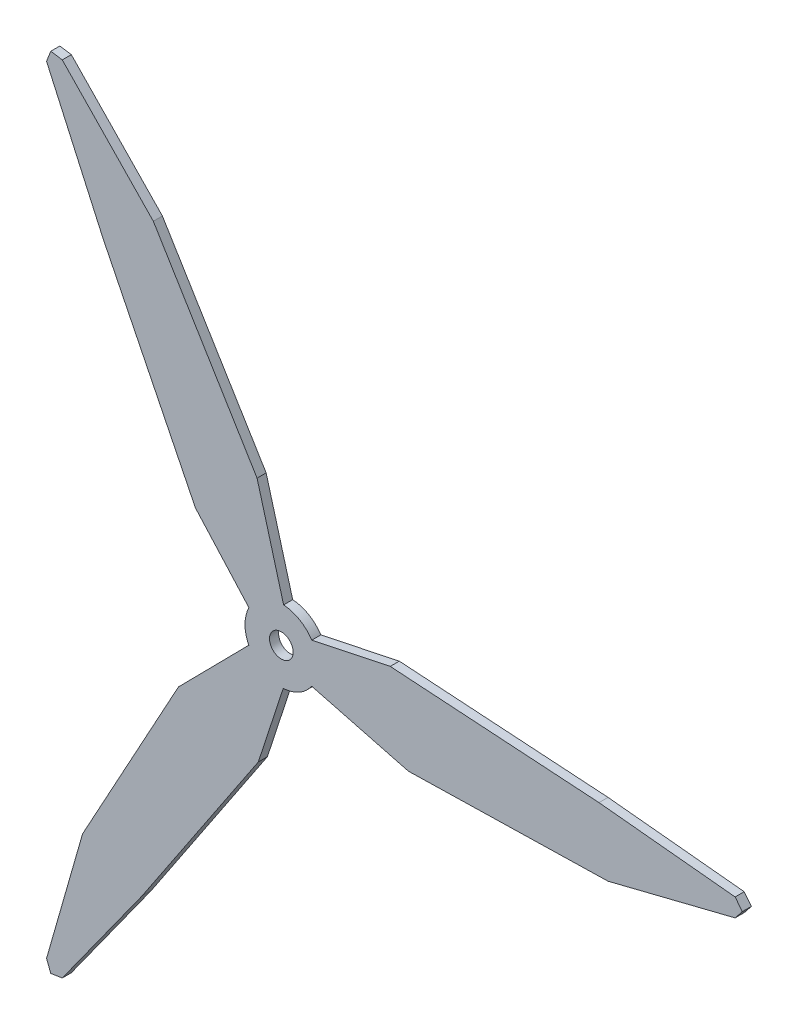
ISO-10303-21;
HEADER;
FILE_DESCRIPTION(('STEP AP214'),'2;1');
FILE_NAME('part.step','',(''),(''),'','','');
FILE_SCHEMA(('AUTOMOTIVE_DESIGN { 1 0 10303 214 1 1 1 1 }'));
ENDSEC;
DATA;
#1=APPLICATION_CONTEXT('core data for automotive mechanical design processes');
#2=APPLICATION_PROTOCOL_DEFINITION('international standard','automotive_design',2000,#1);
#3=PRODUCT_CONTEXT('',#1,'mechanical');
#4=PRODUCT('Part','Part','',(#3));
#5=PRODUCT_RELATED_PRODUCT_CATEGORY('part','',(#4));
#6=PRODUCT_DEFINITION_FORMATION('','',#4);
#7=PRODUCT_DEFINITION_CONTEXT('part definition',#1,'design');
#8=PRODUCT_DEFINITION('design','',#6,#7);
#9=PRODUCT_DEFINITION_SHAPE('','',#8);
#10=(LENGTH_UNIT() NAMED_UNIT(*) SI_UNIT(.MILLI.,.METRE.));
#11=(NAMED_UNIT(*) PLANE_ANGLE_UNIT() SI_UNIT($,.RADIAN.));
#12=(NAMED_UNIT(*) SI_UNIT($,.STERADIAN.) SOLID_ANGLE_UNIT());
#13=UNCERTAINTY_MEASURE_WITH_UNIT(LENGTH_MEASURE(1.E-05),#10,'distance_accuracy_value','');
#14=(GEOMETRIC_REPRESENTATION_CONTEXT(3) GLOBAL_UNCERTAINTY_ASSIGNED_CONTEXT((#13)) GLOBAL_UNIT_ASSIGNED_CONTEXT((#10,
#11,#12)) REPRESENTATION_CONTEXT('',''));
#15=CARTESIAN_POINT('',(0.,0.,0.));
#16=DIRECTION('',(0.,0.,1.));
#17=DIRECTION('',(1.,0.,0.));
#18=AXIS2_PLACEMENT_3D('',#15,#16,#17);
#19=CARTESIAN_POINT('',(0.,0.,2.));
#20=DIRECTION('',(0.,0.,-1.));
#21=DIRECTION('',(-1.,0.,0.));
#22=AXIS2_PLACEMENT_3D('',#19,#20,#21);
#23=CYLINDRICAL_SURFACE('',#22,8.);
#24=DIRECTION('',(0.,0.,-1.));
#25=VECTOR('',#24,1.);
#26=CARTESIAN_POINT('',(-7.16878117640932,-3.55085573415189,2.));
#27=LINE('',#26,#25);
#28=CARTESIAN_POINT('',(-7.16878117640932,-3.55085573415189,2.));
#29=VERTEX_POINT('',#28);
#30=CARTESIAN_POINT('',(-7.16878117640932,-3.55085573415189,0.));
#31=VERTEX_POINT('',#30);
#32=EDGE_CURVE('E62',#29,#31,#27,.T.);
#33=ORIENTED_EDGE('',*,*,#32,.F.);
#34=CARTESIAN_POINT('',(0.,0.,2.));
#35=DIRECTION('',(0.,0.,1.));
#36=DIRECTION('',(1.,0.,0.));
#37=AXIS2_PLACEMENT_3D('',#34,#35,#36);
#38=CIRCLE('',#37,8.);
#39=CARTESIAN_POINT('',(-7.12936328686204,3.62934968333773,2.));
#40=VERTEX_POINT('',#39);
#41=EDGE_CURVE('E401',#40,#29,#38,.T.);
#42=ORIENTED_EDGE('',*,*,#41,.F.);
#43=DIRECTION('',(0.,0.,-1.));
#44=VECTOR('',#43,1.);
#45=CARTESIAN_POINT('',(-7.12936328686204,3.62934968333773,2.));
#46=LINE('',#45,#44);
#47=CARTESIAN_POINT('',(-7.12936328686204,3.62934968333773,0.));
#48=VERTEX_POINT('',#47);
#49=EDGE_CURVE('E316',#48,#40,#46,.F.);
#50=ORIENTED_EDGE('',*,*,#49,.F.);
#51=CARTESIAN_POINT('',(0.,0.,0.));
#52=DIRECTION('',(0.,0.,1.));
#53=DIRECTION('',(1.,0.,0.));
#54=AXIS2_PLACEMENT_3D('',#51,#52,#53);
#55=CIRCLE('',#54,8.);
#56=EDGE_CURVE('E403',#48,#31,#55,.T.);
#57=ORIENTED_EDGE('',*,*,#56,.T.);
#58=EDGE_LOOP('',(#33,#42,#50,#57));
#59=FACE_BOUND('',#58,.T.);
#60=ADVANCED_FACE('F39',(#59),#23,.T.);
#61=DIRECTION('',(0.,0.,-1.));
#62=VECTOR('',#61,1.);
#63=CARTESIAN_POINT('',(0.421572618443538,-7.98888456089952,2.));
#64=LINE('',#63,#62);
#65=CARTESIAN_POINT('',(0.421572618443538,-7.98888456089952,0.));
#66=VERTEX_POINT('',#65);
#67=CARTESIAN_POINT('',(0.421572618443539,-7.98888456089952,2.));
#68=VERTEX_POINT('',#67);
#69=EDGE_CURVE('E261',#66,#68,#64,.F.);
#70=ORIENTED_EDGE('',*,*,#69,.F.);
#71=CARTESIAN_POINT('',(6.65952185915384,-4.43291874586622,0.));
#72=VERTEX_POINT('',#71);
#73=EDGE_CURVE('E243',#66,#72,#55,.T.);
#74=ORIENTED_EDGE('',*,*,#73,.T.);
#75=DIRECTION('',(0.,0.,-1.));
#76=VECTOR('',#75,1.);
#77=CARTESIAN_POINT('',(6.65952185915384,-4.43291874586622,2.));
#78=LINE('',#77,#76);
#79=CARTESIAN_POINT('',(6.65952185915384,-4.43291874586622,2.));
#80=VERTEX_POINT('',#79);
#81=EDGE_CURVE('E11',#80,#72,#78,.T.);
#82=ORIENTED_EDGE('',*,*,#81,.F.);
#83=EDGE_CURVE('E54',#68,#80,#38,.T.);
#84=ORIENTED_EDGE('',*,*,#83,.F.);
#85=EDGE_LOOP('',(#70,#74,#82,#84));
#86=FACE_BOUND('',#85,.T.);
#87=ADVANCED_FACE('F465',(#86),#23,.T.);
#88=DIRECTION('',(0.,0.,-1.));
#89=VECTOR('',#88,1.);
#90=CARTESIAN_POINT('',(0.509259317255481,7.98377448001811,2.));
#91=LINE('',#90,#89);
#92=CARTESIAN_POINT('',(0.509259317255481,7.98377448001811,2.));
#93=VERTEX_POINT('',#92);
#94=CARTESIAN_POINT('',(0.509259317255481,7.98377448001811,0.));
#95=VERTEX_POINT('',#94);
#96=EDGE_CURVE('E334',#93,#95,#91,.T.);
#97=ORIENTED_EDGE('',*,*,#96,.F.);
#98=CARTESIAN_POINT('',(6.7077906684185,4.35953487756179,2.));
#99=VERTEX_POINT('',#98);
#100=EDGE_CURVE('E398',#99,#93,#38,.T.);
#101=ORIENTED_EDGE('',*,*,#100,.F.);
#102=DIRECTION('',(0.,0.,-1.));
#103=VECTOR('',#102,1.);
#104=CARTESIAN_POINT('',(6.7077906684185,4.35953487756179,2.));
#105=LINE('',#104,#103);
#106=CARTESIAN_POINT('',(6.7077906684185,4.35953487756179,0.));
#107=VERTEX_POINT('',#106);
#108=EDGE_CURVE('E47',#107,#99,#105,.F.);
#109=ORIENTED_EDGE('',*,*,#108,.F.);
#110=EDGE_CURVE('E402',#107,#95,#55,.T.);
#111=ORIENTED_EDGE('',*,*,#110,.T.);
#112=EDGE_LOOP('',(#97,#101,#109,#111));
#113=FACE_BOUND('',#112,.T.);
#114=ADVANCED_FACE('F41',(#113),#23,.T.);
#115=CARTESIAN_POINT('',(0.,0.,2.));
#116=DIRECTION('',(0.,0.,1.));
#117=DIRECTION('',(1.,0.,0.));
#118=AXIS2_PLACEMENT_3D('',#115,#116,#117);
#119=PLANE('',#118);
#120=ORIENTED_EDGE('',*,*,#41,.T.);
#121=DIRECTION('',(-0.702412411599189,-0.711770190462772,0.));
#122=VECTOR('',#121,1.);
#123=CARTESIAN_POINT('',(-5.96410161513776,-2.33012701892219,2.));
#124=LINE('',#123,#122);
#125=CARTESIAN_POINT('',(-22.6602540378444,-19.2487113059643,2.));
#126=VERTEX_POINT('',#125);
#127=EDGE_CURVE('E244',#29,#126,#124,.T.);
#128=ORIENTED_EDGE('',*,*,#127,.T.);
#129=DIRECTION('',(-0.480193603526835,-0.877162529484652,0.));
#130=VECTOR('',#129,1.);
#131=CARTESIAN_POINT('',(-22.6602540378444,-19.2487113059643,2.));
#132=LINE('',#131,#130);
#133=CARTESIAN_POINT('',(-43.79422863406,-57.8538290724796,2.));
#134=VERTEX_POINT('',#133);
#135=EDGE_CURVE('E246',#126,#134,#132,.T.);
#136=ORIENTED_EDGE('',*,*,#135,.T.);
#137=DIRECTION('',(-0.275029237468465,-0.961435862934972,0.));
#138=VECTOR('',#137,1.);
#139=CARTESIAN_POINT('',(-43.79422863406,-57.8538290724796,2.));
#140=LINE('',#139,#138);
#141=CARTESIAN_POINT('',(-51.7320508075689,-85.6025403784438,2.));
#142=VERTEX_POINT('',#141);
#143=EDGE_CURVE('E271',#134,#142,#140,.T.);
#144=ORIENTED_EDGE('',*,*,#143,.T.);
#145=DIRECTION('',(0.363904702223363,-0.931436185521974,0.));
#146=VECTOR('',#145,1.);
#147=CARTESIAN_POINT('',(-51.7320508075689,-85.6025403784438,2.));
#148=LINE('',#147,#146);
#149=CARTESIAN_POINT('',(-50.8,-87.9881810244989,2.));
#150=VERTEX_POINT('',#149);
#151=EDGE_CURVE('E269',#142,#150,#148,.T.);
#152=ORIENTED_EDGE('',*,*,#151,.T.);
#153=DIRECTION('',(0.988599749777787,0.15056737607894,0.));
#154=VECTOR('',#153,1.);
#155=CARTESIAN_POINT('',(-50.8,-87.9881810244989,2.));
#156=LINE('',#155,#154);
#157=CARTESIAN_POINT('',(-48.2679491924312,-87.6025403784438,2.));
#158=VERTEX_POINT('',#157);
#159=EDGE_CURVE('E267',#150,#158,#156,.T.);
#160=ORIENTED_EDGE('',*,*,#159,.T.);
#161=DIRECTION('',(0.583691343548209,0.81197562492164,0.));
#162=VECTOR('',#161,1.);
#163=CARTESIAN_POINT('',(-48.2679491924312,-87.6025403784438,2.));
#164=LINE('',#163,#162);
#165=CARTESIAN_POINT('',(-30.6698729810778,-63.1217782649107,2.));
#166=VERTEX_POINT('',#165);
#167=EDGE_CURVE('E265',#158,#166,#164,.T.);
#168=ORIENTED_EDGE('',*,*,#167,.T.);
#169=DIRECTION('',(0.555300239180573,0.831649953024708,0.));
#170=VECTOR('',#169,1.);
#171=CARTESIAN_POINT('',(-30.6698729810778,-63.1217782649107,2.));
#172=LINE('',#171,#170);
#173=CARTESIAN_POINT('',(-5.0717967697245,-24.7846096908265,2.));
#174=VERTEX_POINT('',#173);
#175=EDGE_CURVE('E263',#166,#174,#172,.T.);
#176=ORIENTED_EDGE('',*,*,#175,.T.);
#177=DIRECTION('',(0.310864582458359,0.950454213191246,0.));
#178=VECTOR('',#177,1.);
#179=CARTESIAN_POINT('',(-5.0717967697245,-24.7846096908265,2.));
#180=LINE('',#179,#178);
#181=EDGE_CURVE('E238',#174,#68,#180,.T.);
#182=ORIENTED_EDGE('',*,*,#181,.T.);
#183=ORIENTED_EDGE('',*,*,#83,.T.);
#184=DIRECTION('',(0.967617272396844,-0.252421897147003,0.));
#185=VECTOR('',#184,1.);
#186=CARTESIAN_POINT('',(5.,-4.,2.));
#187=LINE('',#186,#185);
#188=CARTESIAN_POINT('',(28.,-10.,2.));
#189=VERTEX_POINT('',#188);
#190=EDGE_CURVE('E338',#80,#189,#187,.T.);
#191=ORIENTED_EDGE('',*,*,#190,.T.);
#192=DIRECTION('',(0.999741835544943,0.0227214053532942,0.));
#193=VECTOR('',#192,1.);
#194=CARTESIAN_POINT('',(28.,-10.,2.));
#195=LINE('',#194,#193);
#196=CARTESIAN_POINT('',(72.,-9.,2.));
#197=VERTEX_POINT('',#196);
#198=EDGE_CURVE('E340',#189,#197,#195,.T.);
#199=ORIENTED_EDGE('',*,*,#198,.T.);
#200=DIRECTION('',(0.970142500145332,0.242535625036333,0.));
#201=VECTOR('',#200,1.);
#202=CARTESIAN_POINT('',(72.,-9.,2.));
#203=LINE('',#202,#201);
#204=CARTESIAN_POINT('',(100.,-2.,2.));
#205=VERTEX_POINT('',#204);
#206=EDGE_CURVE('E343',#197,#205,#203,.T.);
#207=ORIENTED_EDGE('',*,*,#206,.T.);
#208=DIRECTION('',(0.624695047554422,0.780868809443032,0.));
#209=VECTOR('',#208,1.);
#210=CARTESIAN_POINT('',(100.,-2.,2.));
#211=LINE('',#210,#209);
#212=CARTESIAN_POINT('',(101.6,0.,2.));
#213=VERTEX_POINT('',#212);
#214=EDGE_CURVE('E345',#205,#213,#211,.T.);
#215=ORIENTED_EDGE('',*,*,#214,.T.);
#216=DIRECTION('',(-0.624695047554422,0.780868809443032,0.));
#217=VECTOR('',#216,1.);
#218=CARTESIAN_POINT('',(101.6,0.,2.));
#219=LINE('',#218,#217);
#220=CARTESIAN_POINT('',(100.,2.,2.));
#221=VERTEX_POINT('',#220);
#222=EDGE_CURVE('E347',#213,#221,#219,.T.);
#223=ORIENTED_EDGE('',*,*,#222,.T.);
#224=DIRECTION('',(-0.995037190209989,0.0995037190209989,0.));
#225=VECTOR('',#224,1.);
#226=CARTESIAN_POINT('',(100.,2.,2.));
#227=LINE('',#226,#225);
#228=CARTESIAN_POINT('',(70.,5.,2.));
#229=VERTEX_POINT('',#228);
#230=EDGE_CURVE('E349',#221,#229,#227,.T.);
#231=ORIENTED_EDGE('',*,*,#230,.T.);
#232=DIRECTION('',(-0.997880105965818,0.0650791373455968,0.));
#233=VECTOR('',#232,1.);
#234=CARTESIAN_POINT('',(70.,5.,2.));
#235=LINE('',#234,#233);
#236=CARTESIAN_POINT('',(24.,8.,2.));
#237=VERTEX_POINT('',#236);
#238=EDGE_CURVE('E351',#229,#237,#235,.T.);
#239=ORIENTED_EDGE('',*,*,#238,.T.);
#240=DIRECTION('',(-0.978549784986749,-0.206010481049842,0.));
#241=VECTOR('',#240,1.);
#242=CARTESIAN_POINT('',(24.,8.,2.));
#243=LINE('',#242,#241);
#244=EDGE_CURVE('E353',#237,#99,#243,.T.);
#245=ORIENTED_EDGE('',*,*,#244,.T.);
#246=ORIENTED_EDGE('',*,*,#100,.T.);
#247=DIRECTION('',(-0.265204860797655,0.964192087609775,0.));
#248=VECTOR('',#247,1.);
#249=CARTESIAN_POINT('',(0.964101615137756,6.33012701892219,2.));
#250=LINE('',#249,#248);
#251=CARTESIAN_POINT('',(-5.33974596215561,29.2487113059643,2.));
#252=VERTEX_POINT('',#251);
#253=EDGE_CURVE('E302',#93,#252,#250,.T.);
#254=ORIENTED_EDGE('',*,*,#253,.T.);
#255=DIRECTION('',(-0.519548232018108,0.854441124131358,0.));
#256=VECTOR('',#255,1.);
#257=CARTESIAN_POINT('',(-5.33974596215561,29.2487113059643,2.));
#258=LINE('',#257,#256);
#259=CARTESIAN_POINT('',(-28.20577136594,66.8538290724796,2.));
#260=VERTEX_POINT('',#259);
#261=EDGE_CURVE('E329',#252,#260,#258,.T.);
#262=ORIENTED_EDGE('',*,*,#261,.T.);
#263=DIRECTION('',(-0.695113262676867,0.71890023789864,0.));
#264=VECTOR('',#263,1.);
#265=CARTESIAN_POINT('',(-28.20577136594,66.8538290724796,2.));
#266=LINE('',#265,#264);
#267=CARTESIAN_POINT('',(-48.2679491924311,87.6025403784439,2.));
#268=VERTEX_POINT('',#267);
#269=EDGE_CURVE('E327',#260,#268,#266,.T.);
#270=ORIENTED_EDGE('',*,*,#269,.T.);
#271=DIRECTION('',(-0.988599749777787,0.15056737607894,0.));
#272=VECTOR('',#271,1.);
#273=CARTESIAN_POINT('',(-48.2679491924311,87.6025403784439,2.));
#274=LINE('',#273,#272);
#275=CARTESIAN_POINT('',(-50.8,87.988181024499,2.));
#276=VERTEX_POINT('',#275);
#277=EDGE_CURVE('E325',#268,#276,#274,.T.);
#278=ORIENTED_EDGE('',*,*,#277,.T.);
#279=DIRECTION('',(-0.363904702223363,-0.931436185521974,0.));
#280=VECTOR('',#279,1.);
#281=CARTESIAN_POINT('',(-50.8,87.988181024499,2.));
#282=LINE('',#281,#280);
#283=CARTESIAN_POINT('',(-51.7320508075689,85.6025403784439,2.));
#284=VERTEX_POINT('',#283);
#285=EDGE_CURVE('E323',#276,#284,#282,.T.);
#286=ORIENTED_EDGE('',*,*,#285,.T.);
#287=DIRECTION('',(0.41134584666178,-0.911479343942639,0.));
#288=VECTOR('',#287,1.);
#289=CARTESIAN_POINT('',(-51.7320508075689,85.6025403784439,2.));
#290=LINE('',#289,#288);
#291=CARTESIAN_POINT('',(-39.3301270189222,58.1217782649107,2.));
#292=VERTEX_POINT('',#291);
#293=EDGE_CURVE('E321',#284,#292,#290,.T.);
#294=ORIENTED_EDGE('',*,*,#293,.T.);
#295=DIRECTION('',(0.442579866785245,-0.896729090370305,0.));
#296=VECTOR('',#295,1.);
#297=CARTESIAN_POINT('',(-39.3301270189222,58.1217782649107,2.));
#298=LINE('',#297,#296);
#299=CARTESIAN_POINT('',(-18.9282032302755,16.7846096908265,2.));
#300=VERTEX_POINT('',#299);
#301=EDGE_CURVE('E319',#292,#300,#298,.T.);
#302=ORIENTED_EDGE('',*,*,#301,.T.);
#303=DIRECTION('',(0.66768520252839,-0.744443732141404,0.));
#304=VECTOR('',#303,1.);
#305=CARTESIAN_POINT('',(-18.9282032302755,16.7846096908265,2.));
#306=LINE('',#305,#304);
#307=EDGE_CURVE('E297',#300,#40,#306,.T.);
#308=ORIENTED_EDGE('',*,*,#307,.T.);
#309=EDGE_LOOP('',(#120,#128,#136,#144,#152,#160,#168,#176,#182,#183,#191,#199,#207,#215,#223,
#231,#239,#245,#246,#254,#262,#270,#278,#286,#294,#302,#308));
#310=FACE_BOUND('',#309,.T.);
#311=CARTESIAN_POINT('',(0.,0.,2.));
#312=DIRECTION('',(0.,0.,1.));
#313=DIRECTION('',(1.,0.,0.));
#314=AXIS2_PLACEMENT_3D('',#311,#312,#313);
#315=CIRCLE('',#314,2.6);
#316=CARTESIAN_POINT('',(2.6,0.,2.));
#317=VERTEX_POINT('',#316);
#318=EDGE_CURVE('E393',#317,#317,#315,.T.);
#319=ORIENTED_EDGE('',*,*,#318,.F.);
#320=EDGE_LOOP('',(#319));
#321=FACE_BOUND('',#320,.T.);
#322=ADVANCED_FACE('F412',(#310,#321),#119,.T.);
#323=CARTESIAN_POINT('',(0.,0.,0.));
#324=DIRECTION('',(0.,0.,1.));
#325=DIRECTION('',(1.,0.,0.));
#326=AXIS2_PLACEMENT_3D('',#323,#324,#325);
#327=PLANE('',#326);
#328=ORIENTED_EDGE('',*,*,#73,.F.);
#329=DIRECTION('',(0.310864582458359,0.950454213191246,0.));
#330=VECTOR('',#329,1.);
#331=CARTESIAN_POINT('',(-5.0717967697245,-24.7846096908265,0.));
#332=LINE('',#331,#330);
#333=CARTESIAN_POINT('',(-5.0717967697245,-24.7846096908265,0.));
#334=VERTEX_POINT('',#333);
#335=EDGE_CURVE('E232',#334,#66,#332,.T.);
#336=ORIENTED_EDGE('',*,*,#335,.F.);
#337=DIRECTION('',(0.555300239180573,0.831649953024708,0.));
#338=VECTOR('',#337,1.);
#339=CARTESIAN_POINT('',(-30.6698729810778,-63.1217782649107,0.));
#340=LINE('',#339,#338);
#341=CARTESIAN_POINT('',(-30.6698729810778,-63.1217782649107,0.));
#342=VERTEX_POINT('',#341);
#343=EDGE_CURVE('E220',#342,#334,#340,.T.);
#344=ORIENTED_EDGE('',*,*,#343,.F.);
#345=DIRECTION('',(0.583691343548209,0.81197562492164,0.));
#346=VECTOR('',#345,1.);
#347=CARTESIAN_POINT('',(-48.2679491924312,-87.6025403784438,0.));
#348=LINE('',#347,#346);
#349=CARTESIAN_POINT('',(-48.2679491924312,-87.6025403784438,0.));
#350=VERTEX_POINT('',#349);
#351=EDGE_CURVE('E231',#350,#342,#348,.T.);
#352=ORIENTED_EDGE('',*,*,#351,.F.);
#353=DIRECTION('',(0.988599749777787,0.15056737607894,0.));
#354=VECTOR('',#353,1.);
#355=CARTESIAN_POINT('',(-50.8,-87.9881810244989,0.));
#356=LINE('',#355,#354);
#357=CARTESIAN_POINT('',(-50.8,-87.9881810244989,0.));
#358=VERTEX_POINT('',#357);
#359=EDGE_CURVE('E251',#358,#350,#356,.T.);
#360=ORIENTED_EDGE('',*,*,#359,.F.);
#361=DIRECTION('',(0.363904702223363,-0.931436185521974,0.));
#362=VECTOR('',#361,1.);
#363=CARTESIAN_POINT('',(-51.7320508075689,-85.6025403784438,0.));
#364=LINE('',#363,#362);
#365=CARTESIAN_POINT('',(-51.7320508075689,-85.6025403784438,0.));
#366=VERTEX_POINT('',#365);
#367=EDGE_CURVE('E253',#366,#358,#364,.T.);
#368=ORIENTED_EDGE('',*,*,#367,.F.);
#369=DIRECTION('',(-0.275029237468465,-0.961435862934972,0.));
#370=VECTOR('',#369,1.);
#371=CARTESIAN_POINT('',(-43.79422863406,-57.8538290724796,0.));
#372=LINE('',#371,#370);
#373=CARTESIAN_POINT('',(-43.79422863406,-57.8538290724796,0.));
#374=VERTEX_POINT('',#373);
#375=EDGE_CURVE('E255',#374,#366,#372,.T.);
#376=ORIENTED_EDGE('',*,*,#375,.F.);
#377=DIRECTION('',(-0.480193603526835,-0.877162529484652,0.));
#378=VECTOR('',#377,1.);
#379=CARTESIAN_POINT('',(-22.6602540378444,-19.2487113059643,0.));
#380=LINE('',#379,#378);
#381=CARTESIAN_POINT('',(-22.6602540378444,-19.2487113059643,0.));
#382=VERTEX_POINT('',#381);
#383=EDGE_CURVE('E257',#382,#374,#380,.T.);
#384=ORIENTED_EDGE('',*,*,#383,.F.);
#385=DIRECTION('',(-0.702412411599189,-0.711770190462772,0.));
#386=VECTOR('',#385,1.);
#387=CARTESIAN_POINT('',(-5.96410161513776,-2.33012701892219,0.));
#388=LINE('',#387,#386);
#389=EDGE_CURVE('E259',#31,#382,#388,.T.);
#390=ORIENTED_EDGE('',*,*,#389,.F.);
#391=ORIENTED_EDGE('',*,*,#56,.F.);
#392=DIRECTION('',(0.66768520252839,-0.744443732141404,0.));
#393=VECTOR('',#392,1.);
#394=CARTESIAN_POINT('',(-18.9282032302755,16.7846096908265,0.));
#395=LINE('',#394,#393);
#396=CARTESIAN_POINT('',(-18.9282032302755,16.7846096908265,0.));
#397=VERTEX_POINT('',#396);
#398=EDGE_CURVE('E298',#397,#48,#395,.T.);
#399=ORIENTED_EDGE('',*,*,#398,.F.);
#400=DIRECTION('',(0.442579866785245,-0.896729090370305,0.));
#401=VECTOR('',#400,1.);
#402=CARTESIAN_POINT('',(-39.3301270189222,58.1217782649107,0.));
#403=LINE('',#402,#401);
#404=CARTESIAN_POINT('',(-39.3301270189222,58.1217782649107,0.));
#405=VERTEX_POINT('',#404);
#406=EDGE_CURVE('E301',#405,#397,#403,.T.);
#407=ORIENTED_EDGE('',*,*,#406,.F.);
#408=DIRECTION('',(0.41134584666178,-0.911479343942639,0.));
#409=VECTOR('',#408,1.);
#410=CARTESIAN_POINT('',(-51.7320508075689,85.6025403784439,0.));
#411=LINE('',#410,#409);
#412=CARTESIAN_POINT('',(-51.7320508075689,85.6025403784439,0.));
#413=VERTEX_POINT('',#412);
#414=EDGE_CURVE('E304',#413,#405,#411,.T.);
#415=ORIENTED_EDGE('',*,*,#414,.F.);
#416=DIRECTION('',(-0.363904702223363,-0.931436185521974,0.));
#417=VECTOR('',#416,1.);
#418=CARTESIAN_POINT('',(-50.8,87.988181024499,0.));
#419=LINE('',#418,#417);
#420=CARTESIAN_POINT('',(-50.8,87.988181024499,0.));
#421=VERTEX_POINT('',#420);
#422=EDGE_CURVE('E306',#421,#413,#419,.T.);
#423=ORIENTED_EDGE('',*,*,#422,.F.);
#424=DIRECTION('',(-0.988599749777787,0.15056737607894,0.));
#425=VECTOR('',#424,1.);
#426=CARTESIAN_POINT('',(-48.2679491924311,87.6025403784439,0.));
#427=LINE('',#426,#425);
#428=CARTESIAN_POINT('',(-48.2679491924311,87.6025403784439,0.));
#429=VERTEX_POINT('',#428);
#430=EDGE_CURVE('E308',#429,#421,#427,.T.);
#431=ORIENTED_EDGE('',*,*,#430,.F.);
#432=DIRECTION('',(-0.695113262676867,0.71890023789864,0.));
#433=VECTOR('',#432,1.);
#434=CARTESIAN_POINT('',(-28.20577136594,66.8538290724796,0.));
#435=LINE('',#434,#433);
#436=CARTESIAN_POINT('',(-28.20577136594,66.8538290724796,0.));
#437=VERTEX_POINT('',#436);
#438=EDGE_CURVE('E310',#437,#429,#435,.T.);
#439=ORIENTED_EDGE('',*,*,#438,.F.);
#440=DIRECTION('',(-0.519548232018108,0.854441124131358,0.));
#441=VECTOR('',#440,1.);
#442=CARTESIAN_POINT('',(-5.33974596215561,29.2487113059643,0.));
#443=LINE('',#442,#441);
#444=CARTESIAN_POINT('',(-5.33974596215561,29.2487113059643,0.));
#445=VERTEX_POINT('',#444);
#446=EDGE_CURVE('E312',#445,#437,#443,.T.);
#447=ORIENTED_EDGE('',*,*,#446,.F.);
#448=DIRECTION('',(-0.265204860797655,0.964192087609775,0.));
#449=VECTOR('',#448,1.);
#450=CARTESIAN_POINT('',(0.964101615137756,6.33012701892219,0.));
#451=LINE('',#450,#449);
#452=EDGE_CURVE('E314',#95,#445,#451,.T.);
#453=ORIENTED_EDGE('',*,*,#452,.F.);
#454=ORIENTED_EDGE('',*,*,#110,.F.);
#455=DIRECTION('',(-0.978549784986749,-0.206010481049842,0.));
#456=VECTOR('',#455,1.);
#457=CARTESIAN_POINT('',(24.,8.,0.));
#458=LINE('',#457,#456);
#459=CARTESIAN_POINT('',(24.,8.,0.));
#460=VERTEX_POINT('',#459);
#461=EDGE_CURVE('E341',#460,#107,#458,.T.);
#462=ORIENTED_EDGE('',*,*,#461,.F.);
#463=DIRECTION('',(-0.997880105965818,0.0650791373455968,0.));
#464=VECTOR('',#463,1.);
#465=CARTESIAN_POINT('',(70.,5.,0.));
#466=LINE('',#465,#464);
#467=CARTESIAN_POINT('',(70.,5.,0.));
#468=VERTEX_POINT('',#467);
#469=EDGE_CURVE('E368',#468,#460,#466,.T.);
#470=ORIENTED_EDGE('',*,*,#469,.F.);
#471=DIRECTION('',(-0.995037190209989,0.0995037190209989,0.));
#472=VECTOR('',#471,1.);
#473=CARTESIAN_POINT('',(100.,2.,0.));
#474=LINE('',#473,#472);
#475=CARTESIAN_POINT('',(100.,2.,0.));
#476=VERTEX_POINT('',#475);
#477=EDGE_CURVE('E366',#476,#468,#474,.T.);
#478=ORIENTED_EDGE('',*,*,#477,.F.);
#479=DIRECTION('',(-0.624695047554422,0.780868809443032,0.));
#480=VECTOR('',#479,1.);
#481=CARTESIAN_POINT('',(101.6,0.,0.));
#482=LINE('',#481,#480);
#483=CARTESIAN_POINT('',(101.6,0.,0.));
#484=VERTEX_POINT('',#483);
#485=EDGE_CURVE('E364',#484,#476,#482,.T.);
#486=ORIENTED_EDGE('',*,*,#485,.F.);
#487=DIRECTION('',(0.624695047554422,0.780868809443032,0.));
#488=VECTOR('',#487,1.);
#489=CARTESIAN_POINT('',(100.,-2.,0.));
#490=LINE('',#489,#488);
#491=CARTESIAN_POINT('',(100.,-2.,0.));
#492=VERTEX_POINT('',#491);
#493=EDGE_CURVE('E362',#492,#484,#490,.T.);
#494=ORIENTED_EDGE('',*,*,#493,.F.);
#495=DIRECTION('',(0.970142500145332,0.242535625036333,0.));
#496=VECTOR('',#495,1.);
#497=CARTESIAN_POINT('',(72.,-9.,0.));
#498=LINE('',#497,#496);
#499=CARTESIAN_POINT('',(72.,-9.,0.));
#500=VERTEX_POINT('',#499);
#501=EDGE_CURVE('E360',#500,#492,#498,.T.);
#502=ORIENTED_EDGE('',*,*,#501,.F.);
#503=DIRECTION('',(0.999741835544943,0.0227214053532942,0.));
#504=VECTOR('',#503,1.);
#505=CARTESIAN_POINT('',(28.,-10.,0.));
#506=LINE('',#505,#504);
#507=CARTESIAN_POINT('',(28.,-10.,0.));
#508=VERTEX_POINT('',#507);
#509=EDGE_CURVE('E358',#508,#500,#506,.T.);
#510=ORIENTED_EDGE('',*,*,#509,.F.);
#511=DIRECTION('',(0.967617272396844,-0.252421897147003,0.));
#512=VECTOR('',#511,1.);
#513=CARTESIAN_POINT('',(5.,-4.,0.));
#514=LINE('',#513,#512);
#515=EDGE_CURVE('E337',#72,#508,#514,.T.);
#516=ORIENTED_EDGE('',*,*,#515,.F.);
#517=EDGE_LOOP('',(#328,#336,#344,#352,#360,#368,#376,#384,#390,#391,#399,#407,#415,#423,#431,
#439,#447,#453,#454,#462,#470,#478,#486,#494,#502,#510,#516));
#518=FACE_BOUND('',#517,.T.);
#519=CARTESIAN_POINT('',(0.,0.,0.));
#520=DIRECTION('',(0.,0.,1.));
#521=DIRECTION('',(1.,0.,0.));
#522=AXIS2_PLACEMENT_3D('',#519,#520,#521);
#523=CIRCLE('',#522,2.6);
#524=CARTESIAN_POINT('',(2.6,0.,0.));
#525=VERTEX_POINT('',#524);
#526=EDGE_CURVE('E392',#525,#525,#523,.T.);
#527=ORIENTED_EDGE('',*,*,#526,.T.);
#528=EDGE_LOOP('',(#527));
#529=FACE_BOUND('',#528,.T.);
#530=ADVANCED_FACE('F240',(#518,#529),#327,.F.);
#531=CARTESIAN_POINT('',(0.,0.,2.));
#532=DIRECTION('',(0.,0.,-1.));
#533=DIRECTION('',(-1.,0.,0.));
#534=AXIS2_PLACEMENT_3D('',#531,#532,#533);
#535=CYLINDRICAL_SURFACE('',#534,2.6);
#536=ORIENTED_EDGE('',*,*,#318,.T.);
#537=EDGE_LOOP('',(#536));
#538=FACE_BOUND('',#537,.T.);
#539=ORIENTED_EDGE('',*,*,#526,.F.);
#540=EDGE_LOOP('',(#539));
#541=FACE_BOUND('',#540,.T.);
#542=ADVANCED_FACE('F510',(#538,#541),#535,.F.);
#543=CARTESIAN_POINT('',(5.,-4.,2.));
#544=DIRECTION('',(0.252421897147003,0.967617272396844,0.));
#545=DIRECTION('',(-0.967617272396844,0.252421897147003,0.));
#546=AXIS2_PLACEMENT_3D('',#543,#544,#545);
#547=PLANE('',#546);
#548=ORIENTED_EDGE('',*,*,#190,.F.);
#549=ORIENTED_EDGE('',*,*,#81,.T.);
#550=ORIENTED_EDGE('',*,*,#515,.T.);
#551=DIRECTION('',(0.,0.,-1.));
#552=VECTOR('',#551,1.);
#553=CARTESIAN_POINT('',(28.,-10.,2.));
#554=LINE('',#553,#552);
#555=EDGE_CURVE('E389',#189,#508,#554,.T.);
#556=ORIENTED_EDGE('',*,*,#555,.F.);
#557=EDGE_LOOP('',(#548,#549,#550,#556));
#558=FACE_BOUND('',#557,.T.);
#559=ADVANCED_FACE('F467',(#558),#547,.F.);
#560=CARTESIAN_POINT('',(24.,8.,2.));
#561=DIRECTION('',(0.206010481049842,-0.978549784986749,0.));
#562=DIRECTION('',(0.978549784986749,0.206010481049842,0.));
#563=AXIS2_PLACEMENT_3D('',#560,#561,#562);
#564=PLANE('',#563);
#565=ORIENTED_EDGE('',*,*,#461,.T.);
#566=ORIENTED_EDGE('',*,*,#108,.T.);
#567=ORIENTED_EDGE('',*,*,#244,.F.);
#568=DIRECTION('',(0.,0.,-1.));
#569=VECTOR('',#568,1.);
#570=CARTESIAN_POINT('',(24.,8.,2.));
#571=LINE('',#570,#569);
#572=EDGE_CURVE('E356',#237,#460,#571,.T.);
#573=ORIENTED_EDGE('',*,*,#572,.T.);
#574=EDGE_LOOP('',(#565,#566,#567,#573));
#575=FACE_BOUND('',#574,.T.);
#576=ADVANCED_FACE('F408',(#575),#564,.F.);
#577=CARTESIAN_POINT('',(28.,-10.,2.));
#578=DIRECTION('',(-0.0227214053532942,0.999741835544943,0.));
#579=DIRECTION('',(-0.999741835544943,-0.0227214053532942,0.));
#580=AXIS2_PLACEMENT_3D('',#577,#578,#579);
#581=PLANE('',#580);
#582=ORIENTED_EDGE('',*,*,#509,.T.);
#583=DIRECTION('',(0.,0.,-1.));
#584=VECTOR('',#583,1.);
#585=CARTESIAN_POINT('',(72.,-9.,2.));
#586=LINE('',#585,#584);
#587=EDGE_CURVE('E386',#197,#500,#586,.T.);
#588=ORIENTED_EDGE('',*,*,#587,.F.);
#589=ORIENTED_EDGE('',*,*,#198,.F.);
#590=ORIENTED_EDGE('',*,*,#555,.T.);
#591=EDGE_LOOP('',(#582,#588,#589,#590));
#592=FACE_BOUND('',#591,.T.);
#593=ADVANCED_FACE('F472',(#592),#581,.F.);
#594=CARTESIAN_POINT('',(72.,-9.,2.));
#595=DIRECTION('',(-0.242535625036333,0.970142500145332,0.));
#596=DIRECTION('',(-0.970142500145332,-0.242535625036333,0.));
#597=AXIS2_PLACEMENT_3D('',#594,#595,#596);
#598=PLANE('',#597);
#599=ORIENTED_EDGE('',*,*,#501,.T.);
#600=DIRECTION('',(0.,0.,-1.));
#601=VECTOR('',#600,1.);
#602=CARTESIAN_POINT('',(100.,-2.,2.));
#603=LINE('',#602,#601);
#604=EDGE_CURVE('E383',#205,#492,#603,.T.);
#605=ORIENTED_EDGE('',*,*,#604,.F.);
#606=ORIENTED_EDGE('',*,*,#206,.F.);
#607=ORIENTED_EDGE('',*,*,#587,.T.);
#608=EDGE_LOOP('',(#599,#605,#606,#607));
#609=FACE_BOUND('',#608,.T.);
#610=ADVANCED_FACE('F478',(#609),#598,.F.);
#611=CARTESIAN_POINT('',(100.,-2.,2.));
#612=DIRECTION('',(-0.780868809443032,0.624695047554422,0.));
#613=DIRECTION('',(-0.624695047554422,-0.780868809443032,0.));
#614=AXIS2_PLACEMENT_3D('',#611,#612,#613);
#615=PLANE('',#614);
#616=ORIENTED_EDGE('',*,*,#493,.T.);
#617=DIRECTION('',(0.,0.,-1.));
#618=VECTOR('',#617,1.);
#619=CARTESIAN_POINT('',(101.6,0.,2.));
#620=LINE('',#619,#618);
#621=EDGE_CURVE('E380',#213,#484,#620,.T.);
#622=ORIENTED_EDGE('',*,*,#621,.F.);
#623=ORIENTED_EDGE('',*,*,#214,.F.);
#624=ORIENTED_EDGE('',*,*,#604,.T.);
#625=EDGE_LOOP('',(#616,#622,#623,#624));
#626=FACE_BOUND('',#625,.T.);
#627=ADVANCED_FACE('F482',(#626),#615,.F.);
#628=CARTESIAN_POINT('',(101.6,0.,2.));
#629=DIRECTION('',(-0.780868809443032,-0.624695047554422,0.));
#630=DIRECTION('',(0.624695047554422,-0.780868809443032,0.));
#631=AXIS2_PLACEMENT_3D('',#628,#629,#630);
#632=PLANE('',#631);
#633=ORIENTED_EDGE('',*,*,#485,.T.);
#634=DIRECTION('',(0.,0.,-1.));
#635=VECTOR('',#634,1.);
#636=CARTESIAN_POINT('',(100.,2.,2.));
#637=LINE('',#636,#635);
#638=EDGE_CURVE('E377',#221,#476,#637,.T.);
#639=ORIENTED_EDGE('',*,*,#638,.F.);
#640=ORIENTED_EDGE('',*,*,#222,.F.);
#641=ORIENTED_EDGE('',*,*,#621,.T.);
#642=EDGE_LOOP('',(#633,#639,#640,#641));
#643=FACE_BOUND('',#642,.T.);
#644=ADVANCED_FACE('F487',(#643),#632,.F.);
#645=CARTESIAN_POINT('',(100.,2.,2.));
#646=DIRECTION('',(-0.0995037190209989,-0.995037190209989,0.));
#647=DIRECTION('',(0.995037190209989,-0.0995037190209989,0.));
#648=AXIS2_PLACEMENT_3D('',#645,#646,#647);
#649=PLANE('',#648);
#650=ORIENTED_EDGE('',*,*,#477,.T.);
#651=DIRECTION('',(0.,0.,-1.));
#652=VECTOR('',#651,1.);
#653=CARTESIAN_POINT('',(70.,5.,2.));
#654=LINE('',#653,#652);
#655=EDGE_CURVE('E374',#229,#468,#654,.T.);
#656=ORIENTED_EDGE('',*,*,#655,.F.);
#657=ORIENTED_EDGE('',*,*,#230,.F.);
#658=ORIENTED_EDGE('',*,*,#638,.T.);
#659=EDGE_LOOP('',(#650,#656,#657,#658));
#660=FACE_BOUND('',#659,.T.);
#661=ADVANCED_FACE('F489',(#660),#649,.F.);
#662=CARTESIAN_POINT('',(70.,5.,2.));
#663=DIRECTION('',(-0.0650791373455968,-0.997880105965818,0.));
#664=DIRECTION('',(0.997880105965818,-0.0650791373455968,0.));
#665=AXIS2_PLACEMENT_3D('',#662,#663,#664);
#666=PLANE('',#665);
#667=ORIENTED_EDGE('',*,*,#469,.T.);
#668=ORIENTED_EDGE('',*,*,#572,.F.);
#669=ORIENTED_EDGE('',*,*,#238,.F.);
#670=ORIENTED_EDGE('',*,*,#655,.T.);
#671=EDGE_LOOP('',(#667,#668,#669,#670));
#672=FACE_BOUND('',#671,.T.);
#673=ADVANCED_FACE('F420',(#672),#666,.F.);
#674=CARTESIAN_POINT('',(0.964101615137756,6.33012701892219,2.));
#675=DIRECTION('',(-0.964192087609775,-0.265204860797655,0.));
#676=DIRECTION('',(0.265204860797655,-0.964192087609775,0.));
#677=AXIS2_PLACEMENT_3D('',#674,#675,#676);
#678=PLANE('',#677);
#679=ORIENTED_EDGE('',*,*,#253,.F.);
#680=ORIENTED_EDGE('',*,*,#96,.T.);
#681=ORIENTED_EDGE('',*,*,#452,.T.);
#682=DIRECTION('',(0.,0.,-1.));
#683=VECTOR('',#682,1.);
#684=CARTESIAN_POINT('',(-5.33974596215561,29.2487113059643,2.));
#685=LINE('',#684,#683);
#686=EDGE_CURVE('E276',#252,#445,#685,.T.);
#687=ORIENTED_EDGE('',*,*,#686,.F.);
#688=EDGE_LOOP('',(#679,#680,#681,#687));
#689=FACE_BOUND('',#688,.T.);
#690=ADVANCED_FACE('F426',(#689),#678,.F.);
#691=CARTESIAN_POINT('',(-18.9282032302755,16.7846096908265,2.));
#692=DIRECTION('',(0.744443732141404,0.66768520252839,0.));
#693=DIRECTION('',(-0.66768520252839,0.744443732141404,0.));
#694=AXIS2_PLACEMENT_3D('',#691,#692,#693);
#695=PLANE('',#694);
#696=ORIENTED_EDGE('',*,*,#398,.T.);
#697=ORIENTED_EDGE('',*,*,#49,.T.);
#698=ORIENTED_EDGE('',*,*,#307,.F.);
#699=DIRECTION('',(0.,0.,-1.));
#700=VECTOR('',#699,1.);
#701=CARTESIAN_POINT('',(-18.9282032302755,16.7846096908265,2.));
#702=LINE('',#701,#700);
#703=EDGE_CURVE('E294',#300,#397,#702,.T.);
#704=ORIENTED_EDGE('',*,*,#703,.T.);
#705=EDGE_LOOP('',(#696,#697,#698,#704));
#706=FACE_BOUND('',#705,.T.);
#707=ADVANCED_FACE('F460',(#706),#695,.F.);
#708=CARTESIAN_POINT('',(-5.33974596215561,29.2487113059643,2.));
#709=DIRECTION('',(-0.854441124131358,-0.519548232018108,0.));
#710=DIRECTION('',(0.519548232018108,-0.854441124131358,0.));
#711=AXIS2_PLACEMENT_3D('',#708,#709,#710);
#712=PLANE('',#711);
#713=ORIENTED_EDGE('',*,*,#446,.T.);
#714=DIRECTION('',(0.,0.,-1.));
#715=VECTOR('',#714,1.);
#716=CARTESIAN_POINT('',(-28.20577136594,66.8538290724796,2.));
#717=LINE('',#716,#715);
#718=EDGE_CURVE('E279',#260,#437,#717,.T.);
#719=ORIENTED_EDGE('',*,*,#718,.F.);
#720=ORIENTED_EDGE('',*,*,#261,.F.);
#721=ORIENTED_EDGE('',*,*,#686,.T.);
#722=EDGE_LOOP('',(#713,#719,#720,#721));
#723=FACE_BOUND('',#722,.T.);
#724=ADVANCED_FACE('F433',(#723),#712,.F.);
#725=CARTESIAN_POINT('',(-28.20577136594,66.8538290724796,2.));
#726=DIRECTION('',(-0.71890023789864,-0.695113262676867,0.));
#727=DIRECTION('',(0.695113262676867,-0.71890023789864,0.));
#728=AXIS2_PLACEMENT_3D('',#725,#726,#727);
#729=PLANE('',#728);
#730=ORIENTED_EDGE('',*,*,#438,.T.);
#731=DIRECTION('',(0.,0.,-1.));
#732=VECTOR('',#731,1.);
#733=CARTESIAN_POINT('',(-48.2679491924311,87.6025403784439,2.));
#734=LINE('',#733,#732);
#735=EDGE_CURVE('E282',#268,#429,#734,.T.);
#736=ORIENTED_EDGE('',*,*,#735,.F.);
#737=ORIENTED_EDGE('',*,*,#269,.F.);
#738=ORIENTED_EDGE('',*,*,#718,.T.);
#739=EDGE_LOOP('',(#730,#736,#737,#738));
#740=FACE_BOUND('',#739,.T.);
#741=ADVANCED_FACE('F436',(#740),#729,.F.);
#742=CARTESIAN_POINT('',(-48.2679491924311,87.6025403784439,2.));
#743=DIRECTION('',(-0.15056737607894,-0.988599749777787,0.));
#744=DIRECTION('',(0.988599749777787,-0.15056737607894,0.));
#745=AXIS2_PLACEMENT_3D('',#742,#743,#744);
#746=PLANE('',#745);
#747=ORIENTED_EDGE('',*,*,#430,.T.);
#748=DIRECTION('',(0.,0.,-1.));
#749=VECTOR('',#748,1.);
#750=CARTESIAN_POINT('',(-50.8,87.988181024499,2.));
#751=LINE('',#750,#749);
#752=EDGE_CURVE('E285',#276,#421,#751,.T.);
#753=ORIENTED_EDGE('',*,*,#752,.F.);
#754=ORIENTED_EDGE('',*,*,#277,.F.);
#755=ORIENTED_EDGE('',*,*,#735,.T.);
#756=EDGE_LOOP('',(#747,#753,#754,#755));
#757=FACE_BOUND('',#756,.T.);
#758=ADVANCED_FACE('F441',(#757),#746,.F.);
#759=CARTESIAN_POINT('',(-50.8,87.988181024499,2.));
#760=DIRECTION('',(0.931436185521974,-0.363904702223363,0.));
#761=DIRECTION('',(0.363904702223363,0.931436185521974,0.));
#762=AXIS2_PLACEMENT_3D('',#759,#760,#761);
#763=PLANE('',#762);
#764=ORIENTED_EDGE('',*,*,#422,.T.);
#765=DIRECTION('',(0.,0.,-1.));
#766=VECTOR('',#765,1.);
#767=CARTESIAN_POINT('',(-51.7320508075689,85.6025403784439,2.));
#768=LINE('',#767,#766);
#769=EDGE_CURVE('E288',#284,#413,#768,.T.);
#770=ORIENTED_EDGE('',*,*,#769,.F.);
#771=ORIENTED_EDGE('',*,*,#285,.F.);
#772=ORIENTED_EDGE('',*,*,#752,.T.);
#773=EDGE_LOOP('',(#764,#770,#771,#772));
#774=FACE_BOUND('',#773,.T.);
#775=ADVANCED_FACE('F447',(#774),#763,.F.);
#776=CARTESIAN_POINT('',(-51.7320508075689,85.6025403784439,2.));
#777=DIRECTION('',(0.911479343942639,0.41134584666178,0.));
#778=DIRECTION('',(-0.41134584666178,0.911479343942639,0.));
#779=AXIS2_PLACEMENT_3D('',#776,#777,#778);
#780=PLANE('',#779);
#781=ORIENTED_EDGE('',*,*,#414,.T.);
#782=DIRECTION('',(0.,0.,-1.));
#783=VECTOR('',#782,1.);
#784=CARTESIAN_POINT('',(-39.3301270189222,58.1217782649107,2.));
#785=LINE('',#784,#783);
#786=EDGE_CURVE('E291',#292,#405,#785,.T.);
#787=ORIENTED_EDGE('',*,*,#786,.F.);
#788=ORIENTED_EDGE('',*,*,#293,.F.);
#789=ORIENTED_EDGE('',*,*,#769,.T.);
#790=EDGE_LOOP('',(#781,#787,#788,#789));
#791=FACE_BOUND('',#790,.T.);
#792=ADVANCED_FACE('F451',(#791),#780,.F.);
#793=CARTESIAN_POINT('',(-39.3301270189222,58.1217782649107,2.));
#794=DIRECTION('',(0.896729090370305,0.442579866785245,0.));
#795=DIRECTION('',(-0.442579866785245,0.896729090370305,0.));
#796=AXIS2_PLACEMENT_3D('',#793,#794,#795);
#797=PLANE('',#796);
#798=ORIENTED_EDGE('',*,*,#406,.T.);
#799=ORIENTED_EDGE('',*,*,#703,.F.);
#800=ORIENTED_EDGE('',*,*,#301,.F.);
#801=ORIENTED_EDGE('',*,*,#786,.T.);
#802=EDGE_LOOP('',(#798,#799,#800,#801));
#803=FACE_BOUND('',#802,.T.);
#804=ADVANCED_FACE('F456',(#803),#797,.F.);
#805=CARTESIAN_POINT('',(-5.96410161513776,-2.33012701892219,2.));
#806=DIRECTION('',(0.711770190462772,-0.702412411599189,0.));
#807=DIRECTION('',(0.702412411599189,0.711770190462772,0.));
#808=AXIS2_PLACEMENT_3D('',#805,#806,#807);
#809=PLANE('',#808);
#810=ORIENTED_EDGE('',*,*,#127,.F.);
#811=ORIENTED_EDGE('',*,*,#32,.T.);
#812=ORIENTED_EDGE('',*,*,#389,.T.);
#813=DIRECTION('',(0.,0.,-1.));
#814=VECTOR('',#813,1.);
#815=CARTESIAN_POINT('',(-22.6602540378444,-19.2487113059643,2.));
#816=LINE('',#815,#814);
#817=EDGE_CURVE('E839',#126,#382,#816,.T.);
#818=ORIENTED_EDGE('',*,*,#817,.F.);
#819=EDGE_LOOP('',(#810,#811,#812,#818));
#820=FACE_BOUND('',#819,.T.);
#821=ADVANCED_FACE('F615',(#820),#809,.F.);
#822=CARTESIAN_POINT('',(-5.0717967697245,-24.7846096908265,2.));
#823=DIRECTION('',(-0.950454213191246,0.310864582458359,0.));
#824=DIRECTION('',(-0.310864582458359,-0.950454213191246,0.));
#825=AXIS2_PLACEMENT_3D('',#822,#823,#824);
#826=PLANE('',#825);
#827=ORIENTED_EDGE('',*,*,#335,.T.);
#828=ORIENTED_EDGE('',*,*,#69,.T.);
#829=ORIENTED_EDGE('',*,*,#181,.F.);
#830=DIRECTION('',(0.,0.,-1.));
#831=VECTOR('',#830,1.);
#832=CARTESIAN_POINT('',(-5.0717967697245,-24.7846096908265,2.));
#833=LINE('',#832,#831);
#834=EDGE_CURVE('E224',#174,#334,#833,.T.);
#835=ORIENTED_EDGE('',*,*,#834,.T.);
#836=EDGE_LOOP('',(#827,#828,#829,#835));
#837=FACE_BOUND('',#836,.T.);
#838=ADVANCED_FACE('F236',(#837),#826,.F.);
#839=CARTESIAN_POINT('',(-22.6602540378444,-19.2487113059643,2.));
#840=DIRECTION('',(0.877162529484652,-0.480193603526835,0.));
#841=DIRECTION('',(0.480193603526835,0.877162529484652,0.));
#842=AXIS2_PLACEMENT_3D('',#839,#840,#841);
#843=PLANE('',#842);
#844=ORIENTED_EDGE('',*,*,#383,.T.);
#845=DIRECTION('',(0.,0.,-1.));
#846=VECTOR('',#845,1.);
#847=CARTESIAN_POINT('',(-43.79422863406,-57.8538290724796,2.));
#848=LINE('',#847,#846);
#849=EDGE_CURVE('E834',#134,#374,#848,.T.);
#850=ORIENTED_EDGE('',*,*,#849,.F.);
#851=ORIENTED_EDGE('',*,*,#135,.F.);
#852=ORIENTED_EDGE('',*,*,#817,.T.);
#853=EDGE_LOOP('',(#844,#850,#851,#852));
#854=FACE_BOUND('',#853,.T.);
#855=ADVANCED_FACE('F635',(#854),#843,.F.);
#856=CARTESIAN_POINT('',(-43.79422863406,-57.8538290724796,2.));
#857=DIRECTION('',(0.961435862934972,-0.275029237468465,0.));
#858=DIRECTION('',(0.275029237468465,0.961435862934972,0.));
#859=AXIS2_PLACEMENT_3D('',#856,#857,#858);
#860=PLANE('',#859);
#861=ORIENTED_EDGE('',*,*,#375,.T.);
#862=DIRECTION('',(0.,0.,-1.));
#863=VECTOR('',#862,1.);
#864=CARTESIAN_POINT('',(-51.7320508075689,-85.6025403784438,2.));
#865=LINE('',#864,#863);
#866=EDGE_CURVE('E830',#142,#366,#865,.T.);
#867=ORIENTED_EDGE('',*,*,#866,.F.);
#868=ORIENTED_EDGE('',*,*,#143,.F.);
#869=ORIENTED_EDGE('',*,*,#849,.T.);
#870=EDGE_LOOP('',(#861,#867,#868,#869));
#871=FACE_BOUND('',#870,.T.);
#872=ADVANCED_FACE('F645',(#871),#860,.F.);
#873=CARTESIAN_POINT('',(-51.7320508075689,-85.6025403784438,2.));
#874=DIRECTION('',(0.931436185521974,0.363904702223363,0.));
#875=DIRECTION('',(-0.363904702223363,0.931436185521974,0.));
#876=AXIS2_PLACEMENT_3D('',#873,#874,#875);
#877=PLANE('',#876);
#878=ORIENTED_EDGE('',*,*,#367,.T.);
#879=DIRECTION('',(0.,0.,-1.));
#880=VECTOR('',#879,1.);
#881=CARTESIAN_POINT('',(-50.8,-87.9881810244989,2.));
#882=LINE('',#881,#880);
#883=EDGE_CURVE('E828',#150,#358,#882,.T.);
#884=ORIENTED_EDGE('',*,*,#883,.F.);
#885=ORIENTED_EDGE('',*,*,#151,.F.);
#886=ORIENTED_EDGE('',*,*,#866,.T.);
#887=EDGE_LOOP('',(#878,#884,#885,#886));
#888=FACE_BOUND('',#887,.T.);
#889=ADVANCED_FACE('F656',(#888),#877,.F.);
#890=CARTESIAN_POINT('',(-50.8,-87.9881810244989,2.));
#891=DIRECTION('',(-0.15056737607894,0.988599749777787,0.));
#892=DIRECTION('',(-0.988599749777787,-0.15056737607894,0.));
#893=AXIS2_PLACEMENT_3D('',#890,#891,#892);
#894=PLANE('',#893);
#895=ORIENTED_EDGE('',*,*,#359,.T.);
#896=DIRECTION('',(0.,0.,-1.));
#897=VECTOR('',#896,1.);
#898=CARTESIAN_POINT('',(-48.2679491924312,-87.6025403784438,2.));
#899=LINE('',#898,#897);
#900=EDGE_CURVE('E821',#158,#350,#899,.T.);
#901=ORIENTED_EDGE('',*,*,#900,.F.);
#902=ORIENTED_EDGE('',*,*,#159,.F.);
#903=ORIENTED_EDGE('',*,*,#883,.T.);
#904=EDGE_LOOP('',(#895,#901,#902,#903));
#905=FACE_BOUND('',#904,.T.);
#906=ADVANCED_FACE('F667',(#905),#894,.F.);
#907=CARTESIAN_POINT('',(-48.2679491924312,-87.6025403784438,2.));
#908=DIRECTION('',(-0.811975624921639,0.583691343548209,0.));
#909=DIRECTION('',(-0.583691343548209,-0.81197562492164,0.));
#910=AXIS2_PLACEMENT_3D('',#907,#908,#909);
#911=PLANE('',#910);
#912=ORIENTED_EDGE('',*,*,#351,.T.);
#913=DIRECTION('',(0.,0.,-1.));
#914=VECTOR('',#913,1.);
#915=CARTESIAN_POINT('',(-30.6698729810778,-63.1217782649107,2.));
#916=LINE('',#915,#914);
#917=EDGE_CURVE('E227',#166,#342,#916,.T.);
#918=ORIENTED_EDGE('',*,*,#917,.F.);
#919=ORIENTED_EDGE('',*,*,#167,.F.);
#920=ORIENTED_EDGE('',*,*,#900,.T.);
#921=EDGE_LOOP('',(#912,#918,#919,#920));
#922=FACE_BOUND('',#921,.T.);
#923=ADVANCED_FACE('F678',(#922),#911,.F.);
#924=CARTESIAN_POINT('',(-30.6698729810778,-63.1217782649107,2.));
#925=DIRECTION('',(-0.831649953024708,0.555300239180573,0.));
#926=DIRECTION('',(-0.555300239180573,-0.831649953024708,0.));
#927=AXIS2_PLACEMENT_3D('',#924,#925,#926);
#928=PLANE('',#927);
#929=ORIENTED_EDGE('',*,*,#343,.T.);
#930=ORIENTED_EDGE('',*,*,#834,.F.);
#931=ORIENTED_EDGE('',*,*,#175,.F.);
#932=ORIENTED_EDGE('',*,*,#917,.T.);
#933=EDGE_LOOP('',(#929,#930,#931,#932));
#934=FACE_BOUND('',#933,.T.);
#935=ADVANCED_FACE('F222',(#934),#928,.F.);
#936=CLOSED_SHELL('',(#60,#87,#114,#322,#530,#542,#559,#576,#593,#610,#627,#644,#661,#673,#690,
#707,#724,#741,#758,#775,#792,#804,#821,#838,#855,#872,#889,#906,#923,#935));
#937=MANIFOLD_SOLID_BREP('B2',#936);
#938=ADVANCED_BREP_SHAPE_REPRESENTATION('',(#18,#937),#14);
#939=SHAPE_DEFINITION_REPRESENTATION(#9,#938);
ENDSEC;
END-ISO-10303-21;
